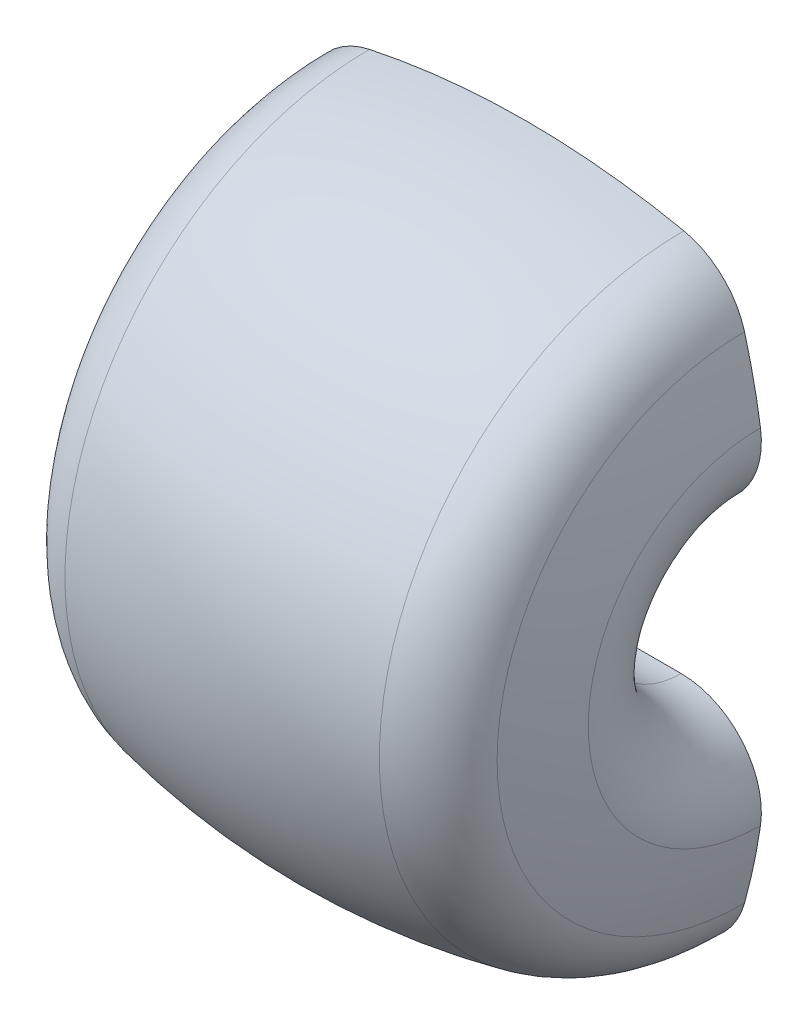
ISO-10303-21;
HEADER;
FILE_DESCRIPTION(('STEP AP214'),'2;1');
FILE_NAME('part.step','',(''),(''),'','','');
FILE_SCHEMA(('AUTOMOTIVE_DESIGN { 1 0 10303 214 1 1 1 1 }'));
ENDSEC;
DATA;
#1=APPLICATION_CONTEXT('core data for automotive mechanical design processes');
#2=APPLICATION_PROTOCOL_DEFINITION('international standard','automotive_design',2000,#1);
#3=PRODUCT_CONTEXT('',#1,'mechanical');
#4=PRODUCT('Part','Part','',(#3));
#5=PRODUCT_RELATED_PRODUCT_CATEGORY('part','',(#4));
#6=PRODUCT_DEFINITION_FORMATION('','',#4);
#7=PRODUCT_DEFINITION_CONTEXT('part definition',#1,'design');
#8=PRODUCT_DEFINITION('design','',#6,#7);
#9=PRODUCT_DEFINITION_SHAPE('','',#8);
#10=(LENGTH_UNIT() NAMED_UNIT(*) SI_UNIT(.MILLI.,.METRE.));
#11=(NAMED_UNIT(*) PLANE_ANGLE_UNIT() SI_UNIT($,.RADIAN.));
#12=(NAMED_UNIT(*) SI_UNIT($,.STERADIAN.) SOLID_ANGLE_UNIT());
#13=UNCERTAINTY_MEASURE_WITH_UNIT(LENGTH_MEASURE(1.E-05),#10,'distance_accuracy_value','');
#14=(GEOMETRIC_REPRESENTATION_CONTEXT(3) GLOBAL_UNCERTAINTY_ASSIGNED_CONTEXT((#13)) GLOBAL_UNIT_ASSIGNED_CONTEXT((#10,
#11,#12)) REPRESENTATION_CONTEXT('',''));
#15=CARTESIAN_POINT('',(0.,0.,0.));
#16=DIRECTION('',(0.,0.,1.));
#17=DIRECTION('',(1.,0.,0.));
#18=AXIS2_PLACEMENT_3D('',#15,#16,#17);
#19=CARTESIAN_POINT('',(23.971603069643,0.,0.));
#20=DIRECTION('',(-1.,0.,0.));
#21=DIRECTION('',(0.,-1.,0.));
#22=AXIS2_PLACEMENT_3D('',#19,#20,#21);
#23=DEGENERATE_TOROIDAL_SURFACE('',#22,4.99999999999999,38.971603069643,.T.);
#24=CARTESIAN_POINT('',(23.971603069643,5.,0.));
#25=DIRECTION('',(0.,0.,1.));
#26=DIRECTION('',(-1.,0.,0.));
#27=AXIS2_PLACEMENT_3D('',#24,#25,#26);
#28=CIRCLE('',#27,38.971603069643);
#29=CARTESIAN_POINT('',(-13.5806306200409,15.4218803837491,0.));
#30=VERTEX_POINT('',#29);
#31=CARTESIAN_POINT('',(-14.5755783657455,10.7359087514578,0.));
#32=VERTEX_POINT('',#31);
#33=EDGE_CURVE('E186',#30,#32,#28,.T.);
#34=ORIENTED_EDGE('',*,*,#33,.T.);
#35=CARTESIAN_POINT('',(-14.5755783657455,0.,0.));
#36=DIRECTION('',(1.,0.,0.));
#37=DIRECTION('',(0.,1.,0.));
#38=AXIS2_PLACEMENT_3D('',#35,#36,#37);
#39=CIRCLE('',#38,10.7359087514578);
#40=CARTESIAN_POINT('',(-14.5755783657455,-10.7359087514578,0.));
#41=VERTEX_POINT('',#40);
#42=EDGE_CURVE('E11',#32,#41,#39,.T.);
#43=ORIENTED_EDGE('',*,*,#42,.T.);
#44=CARTESIAN_POINT('',(23.971603069643,-4.99999999999999,0.));
#45=DIRECTION('',(0.,0.,-1.));
#46=DIRECTION('',(-1.,0.,0.));
#47=AXIS2_PLACEMENT_3D('',#44,#45,#46);
#48=CIRCLE('',#47,38.971603069643);
#49=CARTESIAN_POINT('',(-13.5806306200409,-15.421880383749,-1.07690415139462E-13));
#50=VERTEX_POINT('',#49);
#51=EDGE_CURVE('E230',#50,#41,#48,.T.);
#52=ORIENTED_EDGE('',*,*,#51,.F.);
#53=CARTESIAN_POINT('',(-13.580630620041,0.,0.));
#54=DIRECTION('',(1.,0.,0.));
#55=DIRECTION('',(0.,1.,0.));
#56=AXIS2_PLACEMENT_3D('',#53,#54,#55);
#57=CIRCLE('',#56,15.4218803837491);
#58=EDGE_CURVE('E258',#50,#30,#57,.F.);
#59=ORIENTED_EDGE('',*,*,#58,.T.);
#60=EDGE_LOOP('',(#34,#43,#52,#59));
#61=FACE_BOUND('',#60,.T.);
#62=ADVANCED_FACE('F39',(#61),#23,.T.);
#63=CARTESIAN_POINT('',(0.,0.,0.));
#64=DIRECTION('',(-1.,0.,0.));
#65=DIRECTION('',(0.,-1.,0.));
#66=AXIS2_PLACEMENT_3D('',#63,#64,#65);
#67=DEGENERATE_TOROIDAL_SURFACE('',#66,27.4062829711118,47.4062829711118,.F.);
#68=CARTESIAN_POINT('',(0.,27.4062829711118,1.91377051121383E-13));
#69=DIRECTION('',(0.,0.,-1.));
#70=DIRECTION('',(1.,0.,0.));
#71=AXIS2_PLACEMENT_3D('',#68,#69,#70);
#72=CIRCLE('',#71,47.4062829711118);
#73=CARTESIAN_POINT('',(9.7959217781913,-18.9768560090465,-1.32514677250998E-13));
#74=VERTEX_POINT('',#73);
#75=CARTESIAN_POINT('',(-9.79592177819129,-18.9768560090465,-1.32514677250998E-13));
#76=VERTEX_POINT('',#75);
#77=EDGE_CURVE('E238',#74,#76,#72,.T.);
#78=ORIENTED_EDGE('',*,*,#77,.F.);
#79=CARTESIAN_POINT('',(9.7959217781913,0.,0.));
#80=DIRECTION('',(-1.,0.,0.));
#81=DIRECTION('',(0.,-1.,0.));
#82=AXIS2_PLACEMENT_3D('',#79,#80,#81);
#83=CIRCLE('',#82,18.9768560090465);
#84=CARTESIAN_POINT('',(9.79592177819129,18.9768560090465,0.));
#85=VERTEX_POINT('',#84);
#86=EDGE_CURVE('E243',#74,#85,#83,.T.);
#87=ORIENTED_EDGE('',*,*,#86,.T.);
#88=CARTESIAN_POINT('',(0.,-27.4062829711118,0.));
#89=DIRECTION('',(0.,0.,1.));
#90=DIRECTION('',(1.,0.,0.));
#91=AXIS2_PLACEMENT_3D('',#88,#89,#90);
#92=CIRCLE('',#91,47.4062829711118);
#93=CARTESIAN_POINT('',(-9.79592177819129,18.9768560090465,0.));
#94=VERTEX_POINT('',#93);
#95=EDGE_CURVE('E227',#85,#94,#92,.T.);
#96=ORIENTED_EDGE('',*,*,#95,.T.);
#97=CARTESIAN_POINT('',(-9.79592177819129,0.,0.));
#98=DIRECTION('',(1.,0.,0.));
#99=DIRECTION('',(0.,1.,0.));
#100=AXIS2_PLACEMENT_3D('',#97,#98,#99);
#101=CIRCLE('',#100,18.9768560090465);
#102=EDGE_CURVE('E241',#94,#76,#101,.T.);
#103=ORIENTED_EDGE('',*,*,#102,.T.);
#104=EDGE_LOOP('',(#78,#87,#96,#103));
#105=FACE_BOUND('',#104,.T.);
#106=ADVANCED_FACE('F308',(#105),#67,.F.);
#107=CARTESIAN_POINT('',(-23.971603069643,0.,0.));
#108=DIRECTION('',(-1.,0.,0.));
#109=DIRECTION('',(0.,-1.,0.));
#110=AXIS2_PLACEMENT_3D('',#107,#108,#109);
#111=DEGENERATE_TOROIDAL_SURFACE('',#110,4.99999999999999,38.971603069643,.T.);
#112=CARTESIAN_POINT('',(-23.971603069643,-5.,0.));
#113=DIRECTION('',(0.,0.,-1.));
#114=DIRECTION('',(1.,0.,0.));
#115=AXIS2_PLACEMENT_3D('',#112,#113,#114);
#116=CIRCLE('',#115,38.971603069643);
#117=CARTESIAN_POINT('',(14.5755783657455,-10.7359087514578,0.));
#118=VERTEX_POINT('',#117);
#119=CARTESIAN_POINT('',(13.5806306200409,-15.421880383749,-1.07690415139462E-13));
#120=VERTEX_POINT('',#119);
#121=EDGE_CURVE('E236',#118,#120,#116,.T.);
#122=ORIENTED_EDGE('',*,*,#121,.F.);
#123=CARTESIAN_POINT('',(14.5755783657455,0.,0.));
#124=DIRECTION('',(-1.,0.,0.));
#125=DIRECTION('',(0.,-1.,0.));
#126=AXIS2_PLACEMENT_3D('',#123,#124,#125);
#127=CIRCLE('',#126,10.7359087514578);
#128=CARTESIAN_POINT('',(14.5755783657455,10.7359087514578,0.));
#129=VERTEX_POINT('',#128);
#130=EDGE_CURVE('E261',#118,#129,#127,.T.);
#131=ORIENTED_EDGE('',*,*,#130,.T.);
#132=CARTESIAN_POINT('',(-23.971603069643,4.99999999999999,0.));
#133=DIRECTION('',(0.,0.,1.));
#134=DIRECTION('',(1.,0.,0.));
#135=AXIS2_PLACEMENT_3D('',#132,#133,#134);
#136=CIRCLE('',#135,38.971603069643);
#137=CARTESIAN_POINT('',(13.5806306200409,15.4218803837491,0.));
#138=VERTEX_POINT('',#137);
#139=EDGE_CURVE('E225',#129,#138,#136,.T.);
#140=ORIENTED_EDGE('',*,*,#139,.T.);
#141=CARTESIAN_POINT('',(13.580630620041,0.,0.));
#142=DIRECTION('',(-1.,0.,0.));
#143=DIRECTION('',(0.,-1.,0.));
#144=AXIS2_PLACEMENT_3D('',#141,#142,#143);
#145=CIRCLE('',#144,15.4218803837491);
#146=EDGE_CURVE('E251',#138,#120,#145,.F.);
#147=ORIENTED_EDGE('',*,*,#146,.T.);
#148=EDGE_LOOP('',(#122,#131,#140,#147));
#149=FACE_BOUND('',#148,.T.);
#150=ADVANCED_FACE('F283',(#149),#111,.T.);
#151=CARTESIAN_POINT('',(-17.5,0.,0.));
#152=DIRECTION('',(-1.,0.,0.));
#153=DIRECTION('',(0.,-1.,0.));
#154=AXIS2_PLACEMENT_3D('',#151,#152,#153);
#155=CYLINDRICAL_SURFACE('',#154,5.);
#156=DIRECTION('',(1.,0.,0.));
#157=VECTOR('',#156,1.);
#158=CARTESIAN_POINT('',(-15.,5.,0.));
#159=LINE('',#158,#157);
#160=CARTESIAN_POINT('',(-9.63003104421189,5.,0.));
#161=VERTEX_POINT('',#160);
#162=CARTESIAN_POINT('',(9.6300310442119,5.,0.));
#163=VERTEX_POINT('',#162);
#164=EDGE_CURVE('E222',#161,#163,#159,.T.);
#165=ORIENTED_EDGE('',*,*,#164,.T.);
#166=CARTESIAN_POINT('',(9.6300310442119,0.,0.));
#167=DIRECTION('',(1.,0.,0.));
#168=DIRECTION('',(0.,1.,0.));
#169=AXIS2_PLACEMENT_3D('',#166,#167,#168);
#170=CIRCLE('',#169,5.);
#171=CARTESIAN_POINT('',(9.6300310442119,-4.99999999999999,0.));
#172=VERTEX_POINT('',#171);
#173=EDGE_CURVE('E271',#163,#172,#170,.T.);
#174=ORIENTED_EDGE('',*,*,#173,.T.);
#175=DIRECTION('',(1.,0.,0.));
#176=VECTOR('',#175,1.);
#177=CARTESIAN_POINT('',(-15.,-5.,0.));
#178=LINE('',#177,#176);
#179=CARTESIAN_POINT('',(-9.63003104421189,-5.,0.));
#180=VERTEX_POINT('',#179);
#181=EDGE_CURVE('E233',#180,#172,#178,.T.);
#182=ORIENTED_EDGE('',*,*,#181,.F.);
#183=CARTESIAN_POINT('',(-9.63003104421189,0.,0.));
#184=DIRECTION('',(1.,0.,0.));
#185=DIRECTION('',(0.,1.,0.));
#186=AXIS2_PLACEMENT_3D('',#183,#184,#185);
#187=CIRCLE('',#186,5.);
#188=EDGE_CURVE('E268',#180,#161,#187,.F.);
#189=ORIENTED_EDGE('',*,*,#188,.T.);
#190=EDGE_LOOP('',(#165,#174,#182,#189));
#191=FACE_BOUND('',#190,.T.);
#192=ADVANCED_FACE('F292',(#191),#155,.F.);
#193=CARTESIAN_POINT('',(23.971603069643,-4.99999999999999,0.));
#194=DIRECTION('',(0.,0.,1.));
#195=DIRECTION('',(-1.,0.,0.));
#196=AXIS2_PLACEMENT_3D('',#193,#194,#195);
#197=PLANE('',#196);
#198=DIRECTION('',(1.,0.,0.));
#199=VECTOR('',#198,1.);
#200=CARTESIAN_POINT('',(6.,-9.5,0.));
#201=LINE('',#200,#199);
#202=CARTESIAN_POINT('',(-5.99999999999999,-9.5,0.));
#203=VERTEX_POINT('',#202);
#204=CARTESIAN_POINT('',(6.,-9.5,0.));
#205=VERTEX_POINT('',#204);
#206=EDGE_CURVE('E206',#203,#205,#201,.T.);
#207=ORIENTED_EDGE('',*,*,#206,.F.);
#208=DIRECTION('',(0.,1.,0.));
#209=VECTOR('',#208,1.);
#210=CARTESIAN_POINT('',(-6.,-9.5,0.));
#211=LINE('',#210,#209);
#212=CARTESIAN_POINT('',(-6.,-14.5,0.));
#213=VERTEX_POINT('',#212);
#214=EDGE_CURVE('E54',#213,#203,#211,.T.);
#215=ORIENTED_EDGE('',*,*,#214,.F.);
#216=DIRECTION('',(-1.,0.,0.));
#217=VECTOR('',#216,1.);
#218=CARTESIAN_POINT('',(6.,-14.5,0.));
#219=LINE('',#218,#217);
#220=CARTESIAN_POINT('',(6.,-14.5,0.));
#221=VERTEX_POINT('',#220);
#222=EDGE_CURVE('E199',#221,#213,#219,.T.);
#223=ORIENTED_EDGE('',*,*,#222,.F.);
#224=DIRECTION('',(0.,-1.,0.));
#225=VECTOR('',#224,1.);
#226=CARTESIAN_POINT('',(6.,-9.5,0.));
#227=LINE('',#226,#225);
#228=EDGE_CURVE('E202',#205,#221,#227,.T.);
#229=ORIENTED_EDGE('',*,*,#228,.F.);
#230=EDGE_LOOP('',(#207,#215,#223,#229));
#231=FACE_BOUND('',#230,.T.);
#232=ORIENTED_EDGE('',*,*,#181,.T.);
#233=CARTESIAN_POINT('',(9.6300310442119,-9.99999999999999,0.));
#234=DIRECTION('',(0.,0.,1.));
#235=DIRECTION('',(0.,-1.,0.));
#236=AXIS2_PLACEMENT_3D('',#233,#234,#235);
#237=CIRCLE('',#236,5.);
#238=EDGE_CURVE('E47',#172,#118,#237,.F.);
#239=ORIENTED_EDGE('',*,*,#238,.T.);
#240=ORIENTED_EDGE('',*,*,#121,.T.);
#241=CARTESIAN_POINT('',(8.7627336473943,-14.0847682863682,0.));
#242=DIRECTION('',(0.,0.,1.));
#243=DIRECTION('',(0.,-1.,0.));
#244=AXIS2_PLACEMENT_3D('',#241,#242,#243);
#245=CIRCLE('',#244,5.);
#246=EDGE_CURVE('E256',#120,#74,#245,.F.);
#247=ORIENTED_EDGE('',*,*,#246,.T.);
#248=ORIENTED_EDGE('',*,*,#77,.T.);
#249=CARTESIAN_POINT('',(-8.76273364739429,-14.0847682863682,0.));
#250=DIRECTION('',(0.,0.,1.));
#251=DIRECTION('',(0.,-1.,0.));
#252=AXIS2_PLACEMENT_3D('',#249,#250,#251);
#253=CIRCLE('',#252,5.);
#254=EDGE_CURVE('E254',#76,#50,#253,.F.);
#255=ORIENTED_EDGE('',*,*,#254,.T.);
#256=ORIENTED_EDGE('',*,*,#51,.T.);
#257=CARTESIAN_POINT('',(-9.63003104421189,-10.,0.));
#258=DIRECTION('',(0.,0.,1.));
#259=DIRECTION('',(0.,-1.,0.));
#260=AXIS2_PLACEMENT_3D('',#257,#258,#259);
#261=CIRCLE('',#260,5.);
#262=EDGE_CURVE('E273',#41,#180,#261,.F.);
#263=ORIENTED_EDGE('',*,*,#262,.T.);
#264=EDGE_LOOP('',(#232,#239,#240,#247,#248,#255,#256,#263));
#265=FACE_BOUND('',#264,.T.);
#266=ADVANCED_FACE('F277',(#231,#265),#197,.F.);
#267=CARTESIAN_POINT('',(23.971603069643,5.,0.));
#268=DIRECTION('',(0.,0.,-1.));
#269=DIRECTION('',(-1.,0.,0.));
#270=AXIS2_PLACEMENT_3D('',#267,#268,#269);
#271=PLANE('',#270);
#272=DIRECTION('',(0.,1.,0.));
#273=VECTOR('',#272,1.);
#274=CARTESIAN_POINT('',(-6.,14.5,0.));
#275=LINE('',#274,#273);
#276=CARTESIAN_POINT('',(-6.,9.5,0.));
#277=VERTEX_POINT('',#276);
#278=CARTESIAN_POINT('',(-6.,14.5,0.));
#279=VERTEX_POINT('',#278);
#280=EDGE_CURVE('E62',#277,#279,#275,.T.);
#281=ORIENTED_EDGE('',*,*,#280,.F.);
#282=DIRECTION('',(-1.,0.,0.));
#283=VECTOR('',#282,1.);
#284=CARTESIAN_POINT('',(6.,9.5,0.));
#285=LINE('',#284,#283);
#286=CARTESIAN_POINT('',(6.,9.5,0.));
#287=VERTEX_POINT('',#286);
#288=EDGE_CURVE('E171',#287,#277,#285,.T.);
#289=ORIENTED_EDGE('',*,*,#288,.F.);
#290=DIRECTION('',(0.,-1.,0.));
#291=VECTOR('',#290,1.);
#292=CARTESIAN_POINT('',(6.,14.5,0.));
#293=LINE('',#292,#291);
#294=CARTESIAN_POINT('',(6.,14.5,0.));
#295=VERTEX_POINT('',#294);
#296=EDGE_CURVE('E174',#295,#287,#293,.T.);
#297=ORIENTED_EDGE('',*,*,#296,.F.);
#298=DIRECTION('',(1.,0.,0.));
#299=VECTOR('',#298,1.);
#300=CARTESIAN_POINT('',(6.,14.5,0.));
#301=LINE('',#300,#299);
#302=EDGE_CURVE('E180',#279,#295,#301,.T.);
#303=ORIENTED_EDGE('',*,*,#302,.F.);
#304=EDGE_LOOP('',(#281,#289,#297,#303));
#305=FACE_BOUND('',#304,.T.);
#306=ORIENTED_EDGE('',*,*,#139,.F.);
#307=CARTESIAN_POINT('',(9.6300310442119,10.,0.));
#308=DIRECTION('',(0.,0.,-1.));
#309=DIRECTION('',(-1.,0.,0.));
#310=AXIS2_PLACEMENT_3D('',#307,#308,#309);
#311=CIRCLE('',#310,5.);
#312=EDGE_CURVE('E266',#129,#163,#311,.T.);
#313=ORIENTED_EDGE('',*,*,#312,.T.);
#314=ORIENTED_EDGE('',*,*,#164,.F.);
#315=CARTESIAN_POINT('',(-9.6300310442119,10.,0.));
#316=DIRECTION('',(0.,0.,-1.));
#317=DIRECTION('',(-1.,0.,0.));
#318=AXIS2_PLACEMENT_3D('',#315,#316,#317);
#319=CIRCLE('',#318,5.);
#320=EDGE_CURVE('E264',#161,#32,#319,.T.);
#321=ORIENTED_EDGE('',*,*,#320,.T.);
#322=ORIENTED_EDGE('',*,*,#33,.F.);
#323=CARTESIAN_POINT('',(-8.7627336473943,14.0847682863682,0.));
#324=DIRECTION('',(0.,0.,-1.));
#325=DIRECTION('',(-1.,0.,0.));
#326=AXIS2_PLACEMENT_3D('',#323,#324,#325);
#327=CIRCLE('',#326,5.);
#328=EDGE_CURVE('E246',#30,#94,#327,.T.);
#329=ORIENTED_EDGE('',*,*,#328,.T.);
#330=ORIENTED_EDGE('',*,*,#95,.F.);
#331=CARTESIAN_POINT('',(8.7627336473943,14.0847682863682,0.));
#332=DIRECTION('',(0.,0.,-1.));
#333=DIRECTION('',(-1.,0.,0.));
#334=AXIS2_PLACEMENT_3D('',#331,#332,#333);
#335=CIRCLE('',#334,5.);
#336=EDGE_CURVE('E248',#85,#138,#335,.T.);
#337=ORIENTED_EDGE('',*,*,#336,.T.);
#338=EDGE_LOOP('',(#306,#313,#314,#321,#322,#329,#330,#337));
#339=FACE_BOUND('',#338,.T.);
#340=ADVANCED_FACE('F290',(#305,#339),#271,.T.);
#341=CARTESIAN_POINT('',(8.7627336473943,0.,0.));
#342=DIRECTION('',(1.,0.,0.));
#343=DIRECTION('',(0.,1.,0.));
#344=AXIS2_PLACEMENT_3D('',#341,#342,#343);
#345=TOROIDAL_SURFACE('',#344,14.0847682863682,5.);
#346=ORIENTED_EDGE('',*,*,#246,.F.);
#347=ORIENTED_EDGE('',*,*,#146,.F.);
#348=ORIENTED_EDGE('',*,*,#336,.F.);
#349=ORIENTED_EDGE('',*,*,#86,.F.);
#350=EDGE_LOOP('',(#346,#347,#348,#349));
#351=FACE_BOUND('',#350,.T.);
#352=ADVANCED_FACE('F311',(#351),#345,.T.);
#353=CARTESIAN_POINT('',(-8.76273364739429,0.,0.));
#354=DIRECTION('',(1.,0.,0.));
#355=DIRECTION('',(0.,1.,0.));
#356=AXIS2_PLACEMENT_3D('',#353,#354,#355);
#357=TOROIDAL_SURFACE('',#356,14.0847682863682,5.);
#358=ORIENTED_EDGE('',*,*,#254,.F.);
#359=ORIENTED_EDGE('',*,*,#102,.F.);
#360=ORIENTED_EDGE('',*,*,#328,.F.);
#361=ORIENTED_EDGE('',*,*,#58,.F.);
#362=EDGE_LOOP('',(#358,#359,#360,#361));
#363=FACE_BOUND('',#362,.T.);
#364=ADVANCED_FACE('F303',(#363),#357,.T.);
#365=CARTESIAN_POINT('',(9.6300310442119,0.,0.));
#366=DIRECTION('',(1.,0.,0.));
#367=DIRECTION('',(0.,1.,0.));
#368=AXIS2_PLACEMENT_3D('',#365,#366,#367);
#369=TOROIDAL_SURFACE('',#368,10.,5.);
#370=ORIENTED_EDGE('',*,*,#238,.F.);
#371=ORIENTED_EDGE('',*,*,#173,.F.);
#372=ORIENTED_EDGE('',*,*,#312,.F.);
#373=ORIENTED_EDGE('',*,*,#130,.F.);
#374=EDGE_LOOP('',(#370,#371,#372,#373));
#375=FACE_BOUND('',#374,.T.);
#376=ADVANCED_FACE('F287',(#375),#369,.T.);
#377=CARTESIAN_POINT('',(-9.6300310442119,0.,0.));
#378=DIRECTION('',(1.,0.,0.));
#379=DIRECTION('',(0.,1.,0.));
#380=AXIS2_PLACEMENT_3D('',#377,#378,#379);
#381=TOROIDAL_SURFACE('',#380,10.,5.);
#382=ORIENTED_EDGE('',*,*,#262,.F.);
#383=ORIENTED_EDGE('',*,*,#42,.F.);
#384=ORIENTED_EDGE('',*,*,#320,.F.);
#385=ORIENTED_EDGE('',*,*,#188,.F.);
#386=EDGE_LOOP('',(#382,#383,#384,#385));
#387=FACE_BOUND('',#386,.T.);
#388=ADVANCED_FACE('F41',(#387),#381,.T.);
#389=CARTESIAN_POINT('',(-6.,14.5,6.));
#390=DIRECTION('',(-1.,0.,0.));
#391=DIRECTION('',(0.,-1.,0.));
#392=AXIS2_PLACEMENT_3D('',#389,#390,#391);
#393=PLANE('',#392);
#394=ORIENTED_EDGE('',*,*,#280,.T.);
#395=DIRECTION('',(0.,0.,-1.));
#396=VECTOR('',#395,1.);
#397=CARTESIAN_POINT('',(-6.,14.5,6.));
#398=LINE('',#397,#396);
#399=CARTESIAN_POINT('',(-6.,14.5,6.));
#400=VERTEX_POINT('',#399);
#401=EDGE_CURVE('E149',#400,#279,#398,.T.);
#402=ORIENTED_EDGE('',*,*,#401,.F.);
#403=DIRECTION('',(0.,1.,0.));
#404=VECTOR('',#403,1.);
#405=CARTESIAN_POINT('',(-6.,14.5,6.));
#406=LINE('',#405,#404);
#407=CARTESIAN_POINT('',(-6.,9.5,6.));
#408=VERTEX_POINT('',#407);
#409=EDGE_CURVE('E153',#408,#400,#406,.T.);
#410=ORIENTED_EDGE('',*,*,#409,.F.);
#411=DIRECTION('',(0.,0.,-1.));
#412=VECTOR('',#411,1.);
#413=CARTESIAN_POINT('',(-6.,9.5,6.));
#414=LINE('',#413,#412);
#415=EDGE_CURVE('E184',#408,#277,#414,.T.);
#416=ORIENTED_EDGE('',*,*,#415,.T.);
#417=EDGE_LOOP('',(#394,#402,#410,#416));
#418=FACE_BOUND('',#417,.T.);
#419=ADVANCED_FACE('F151',(#418),#393,.F.);
#420=CARTESIAN_POINT('',(6.,9.5,6.));
#421=DIRECTION('',(0.,-1.,0.));
#422=DIRECTION('',(0.,0.,-1.));
#423=AXIS2_PLACEMENT_3D('',#420,#421,#422);
#424=PLANE('',#423);
#425=ORIENTED_EDGE('',*,*,#288,.T.);
#426=ORIENTED_EDGE('',*,*,#415,.F.);
#427=DIRECTION('',(-1.,0.,0.));
#428=VECTOR('',#427,1.);
#429=CARTESIAN_POINT('',(6.,9.5,6.));
#430=LINE('',#429,#428);
#431=CARTESIAN_POINT('',(6.,9.5,6.));
#432=VERTEX_POINT('',#431);
#433=EDGE_CURVE('E159',#432,#408,#430,.T.);
#434=ORIENTED_EDGE('',*,*,#433,.F.);
#435=DIRECTION('',(0.,0.,-1.));
#436=VECTOR('',#435,1.);
#437=CARTESIAN_POINT('',(6.,9.5,6.));
#438=LINE('',#437,#436);
#439=EDGE_CURVE('E187',#432,#287,#438,.T.);
#440=ORIENTED_EDGE('',*,*,#439,.T.);
#441=EDGE_LOOP('',(#425,#426,#434,#440));
#442=FACE_BOUND('',#441,.T.);
#443=ADVANCED_FACE('F363',(#442),#424,.F.);
#444=CARTESIAN_POINT('',(6.,14.5,6.));
#445=DIRECTION('',(1.,0.,0.));
#446=DIRECTION('',(0.,1.,0.));
#447=AXIS2_PLACEMENT_3D('',#444,#445,#446);
#448=PLANE('',#447);
#449=ORIENTED_EDGE('',*,*,#296,.T.);
#450=ORIENTED_EDGE('',*,*,#439,.F.);
#451=DIRECTION('',(0.,-1.,0.));
#452=VECTOR('',#451,1.);
#453=CARTESIAN_POINT('',(6.,14.5,6.));
#454=LINE('',#453,#452);
#455=CARTESIAN_POINT('',(6.,14.5,6.));
#456=VERTEX_POINT('',#455);
#457=EDGE_CURVE('E167',#456,#432,#454,.T.);
#458=ORIENTED_EDGE('',*,*,#457,.F.);
#459=DIRECTION('',(0.,0.,-1.));
#460=VECTOR('',#459,1.);
#461=CARTESIAN_POINT('',(6.,14.5,6.));
#462=LINE('',#461,#460);
#463=EDGE_CURVE('E158',#456,#295,#462,.T.);
#464=ORIENTED_EDGE('',*,*,#463,.T.);
#465=EDGE_LOOP('',(#449,#450,#458,#464));
#466=FACE_BOUND('',#465,.T.);
#467=ADVANCED_FACE('F375',(#466),#448,.F.);
#468=CARTESIAN_POINT('',(6.,14.5,6.));
#469=DIRECTION('',(0.,1.,0.));
#470=DIRECTION('',(0.,0.,1.));
#471=AXIS2_PLACEMENT_3D('',#468,#469,#470);
#472=PLANE('',#471);
#473=ORIENTED_EDGE('',*,*,#302,.T.);
#474=ORIENTED_EDGE('',*,*,#463,.F.);
#475=DIRECTION('',(1.,0.,0.));
#476=VECTOR('',#475,1.);
#477=CARTESIAN_POINT('',(6.,14.5,6.));
#478=LINE('',#477,#476);
#479=EDGE_CURVE('E162',#400,#456,#478,.T.);
#480=ORIENTED_EDGE('',*,*,#479,.F.);
#481=ORIENTED_EDGE('',*,*,#401,.T.);
#482=EDGE_LOOP('',(#473,#474,#480,#481));
#483=FACE_BOUND('',#482,.T.);
#484=ADVANCED_FACE('F163',(#483),#472,.F.);
#485=CARTESIAN_POINT('',(0.,0.,6.));
#486=DIRECTION('',(0.,0.,-1.));
#487=DIRECTION('',(-1.,0.,0.));
#488=AXIS2_PLACEMENT_3D('',#485,#486,#487);
#489=PLANE('',#488);
#490=ORIENTED_EDGE('',*,*,#409,.T.);
#491=ORIENTED_EDGE('',*,*,#479,.T.);
#492=ORIENTED_EDGE('',*,*,#457,.T.);
#493=ORIENTED_EDGE('',*,*,#433,.T.);
#494=EDGE_LOOP('',(#490,#491,#492,#493));
#495=FACE_BOUND('',#494,.T.);
#496=ADVANCED_FACE('F169',(#495),#489,.T.);
#497=CARTESIAN_POINT('',(-6.,-9.5,6.));
#498=DIRECTION('',(-1.,0.,0.));
#499=DIRECTION('',(0.,-1.,0.));
#500=AXIS2_PLACEMENT_3D('',#497,#498,#499);
#501=PLANE('',#500);
#502=ORIENTED_EDGE('',*,*,#214,.T.);
#503=DIRECTION('',(0.,0.,-1.));
#504=VECTOR('',#503,1.);
#505=CARTESIAN_POINT('',(-6.,-9.5,6.));
#506=LINE('',#505,#504);
#507=CARTESIAN_POINT('',(-6.,-9.5,6.));
#508=VERTEX_POINT('',#507);
#509=EDGE_CURVE('E190',#508,#203,#506,.T.);
#510=ORIENTED_EDGE('',*,*,#509,.F.);
#511=DIRECTION('',(0.,1.,0.));
#512=VECTOR('',#511,1.);
#513=CARTESIAN_POINT('',(-6.,-9.5,6.));
#514=LINE('',#513,#512);
#515=CARTESIAN_POINT('',(-6.,-14.5,6.));
#516=VERTEX_POINT('',#515);
#517=EDGE_CURVE('E203',#516,#508,#514,.T.);
#518=ORIENTED_EDGE('',*,*,#517,.F.);
#519=DIRECTION('',(0.,0.,-1.));
#520=VECTOR('',#519,1.);
#521=CARTESIAN_POINT('',(-6.,-14.5,6.));
#522=LINE('',#521,#520);
#523=EDGE_CURVE('E197',#516,#213,#522,.T.);
#524=ORIENTED_EDGE('',*,*,#523,.T.);
#525=EDGE_LOOP('',(#502,#510,#518,#524));
#526=FACE_BOUND('',#525,.T.);
#527=ADVANCED_FACE('F405',(#526),#501,.F.);
#528=CARTESIAN_POINT('',(6.,-14.5,6.));
#529=DIRECTION('',(0.,-1.,0.));
#530=DIRECTION('',(0.,0.,-1.));
#531=AXIS2_PLACEMENT_3D('',#528,#529,#530);
#532=PLANE('',#531);
#533=ORIENTED_EDGE('',*,*,#222,.T.);
#534=ORIENTED_EDGE('',*,*,#523,.F.);
#535=DIRECTION('',(-1.,0.,0.));
#536=VECTOR('',#535,1.);
#537=CARTESIAN_POINT('',(6.,-14.5,6.));
#538=LINE('',#537,#536);
#539=CARTESIAN_POINT('',(6.,-14.5,6.));
#540=VERTEX_POINT('',#539);
#541=EDGE_CURVE('E192',#540,#516,#538,.T.);
#542=ORIENTED_EDGE('',*,*,#541,.F.);
#543=DIRECTION('',(0.,0.,-1.));
#544=VECTOR('',#543,1.);
#545=CARTESIAN_POINT('',(6.,-14.5,6.));
#546=LINE('',#545,#544);
#547=EDGE_CURVE('E195',#540,#221,#546,.T.);
#548=ORIENTED_EDGE('',*,*,#547,.T.);
#549=EDGE_LOOP('',(#533,#534,#542,#548));
#550=FACE_BOUND('',#549,.T.);
#551=ADVANCED_FACE('F415',(#550),#532,.F.);
#552=CARTESIAN_POINT('',(6.,-9.5,6.));
#553=DIRECTION('',(1.,0.,0.));
#554=DIRECTION('',(0.,1.,0.));
#555=AXIS2_PLACEMENT_3D('',#552,#553,#554);
#556=PLANE('',#555);
#557=ORIENTED_EDGE('',*,*,#228,.T.);
#558=ORIENTED_EDGE('',*,*,#547,.F.);
#559=DIRECTION('',(0.,-1.,0.));
#560=VECTOR('',#559,1.);
#561=CARTESIAN_POINT('',(6.,-9.5,6.));
#562=LINE('',#561,#560);
#563=CARTESIAN_POINT('',(6.,-9.5,6.));
#564=VERTEX_POINT('',#563);
#565=EDGE_CURVE('E212',#564,#540,#562,.T.);
#566=ORIENTED_EDGE('',*,*,#565,.F.);
#567=DIRECTION('',(0.,0.,-1.));
#568=VECTOR('',#567,1.);
#569=CARTESIAN_POINT('',(6.,-9.5,6.));
#570=LINE('',#569,#568);
#571=EDGE_CURVE('E193',#564,#205,#570,.T.);
#572=ORIENTED_EDGE('',*,*,#571,.T.);
#573=EDGE_LOOP('',(#557,#558,#566,#572));
#574=FACE_BOUND('',#573,.T.);
#575=ADVANCED_FACE('F425',(#574),#556,.F.);
#576=CARTESIAN_POINT('',(6.,-9.5,6.));
#577=DIRECTION('',(0.,1.,0.));
#578=DIRECTION('',(0.,0.,1.));
#579=AXIS2_PLACEMENT_3D('',#576,#577,#578);
#580=PLANE('',#579);
#581=ORIENTED_EDGE('',*,*,#206,.T.);
#582=ORIENTED_EDGE('',*,*,#571,.F.);
#583=DIRECTION('',(1.,0.,0.));
#584=VECTOR('',#583,1.);
#585=CARTESIAN_POINT('',(6.,-9.5,6.));
#586=LINE('',#585,#584);
#587=EDGE_CURVE('E215',#508,#564,#586,.T.);
#588=ORIENTED_EDGE('',*,*,#587,.F.);
#589=ORIENTED_EDGE('',*,*,#509,.T.);
#590=EDGE_LOOP('',(#581,#582,#588,#589));
#591=FACE_BOUND('',#590,.T.);
#592=ADVANCED_FACE('F436',(#591),#580,.F.);
#593=CARTESIAN_POINT('',(0.,0.,6.));
#594=DIRECTION('',(0.,0.,-1.));
#595=DIRECTION('',(-1.,0.,0.));
#596=AXIS2_PLACEMENT_3D('',#593,#594,#595);
#597=PLANE('',#596);
#598=ORIENTED_EDGE('',*,*,#517,.T.);
#599=ORIENTED_EDGE('',*,*,#587,.T.);
#600=ORIENTED_EDGE('',*,*,#565,.T.);
#601=ORIENTED_EDGE('',*,*,#541,.T.);
#602=EDGE_LOOP('',(#598,#599,#600,#601));
#603=FACE_BOUND('',#602,.T.);
#604=ADVANCED_FACE('F447',(#603),#597,.T.);
#605=CLOSED_SHELL('',(#62,#106,#150,#192,#266,#340,#352,#364,#376,#388,#419,#443,#467,#484,#496,
#527,#551,#575,#592,#604));
#606=MANIFOLD_SOLID_BREP('B2',#605);
#607=ADVANCED_BREP_SHAPE_REPRESENTATION('',(#18,#606),#14);
#608=SHAPE_DEFINITION_REPRESENTATION(#9,#607);
ENDSEC;
END-ISO-10303-21;
